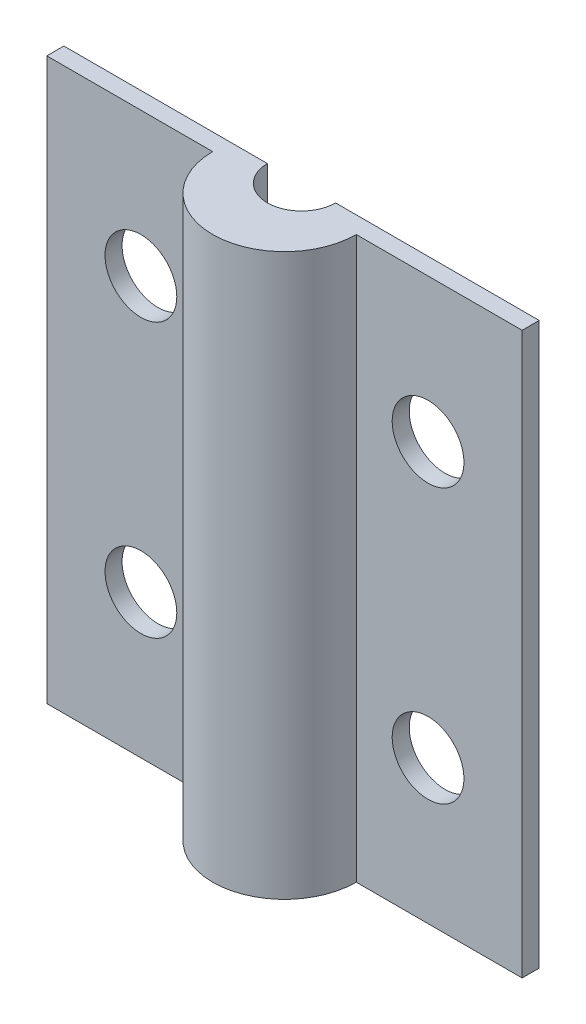
ISO-10303-21;
HEADER;
FILE_DESCRIPTION(('STEP AP214'),'2;1');
FILE_NAME('part.step','',(''),(''),'','','');
FILE_SCHEMA(('AUTOMOTIVE_DESIGN { 1 0 10303 214 1 1 1 1 }'));
ENDSEC;
DATA;
#1=APPLICATION_CONTEXT('core data for automotive mechanical design processes');
#2=APPLICATION_PROTOCOL_DEFINITION('international standard','automotive_design',2000,#1);
#3=PRODUCT_CONTEXT('',#1,'mechanical');
#4=PRODUCT('Part','Part','',(#3));
#5=PRODUCT_RELATED_PRODUCT_CATEGORY('part','',(#4));
#6=PRODUCT_DEFINITION_FORMATION('','',#4);
#7=PRODUCT_DEFINITION_CONTEXT('part definition',#1,'design');
#8=PRODUCT_DEFINITION('design','',#6,#7);
#9=PRODUCT_DEFINITION_SHAPE('','',#8);
#10=(LENGTH_UNIT() NAMED_UNIT(*) SI_UNIT(.MILLI.,.METRE.));
#11=(NAMED_UNIT(*) PLANE_ANGLE_UNIT() SI_UNIT($,.RADIAN.));
#12=(NAMED_UNIT(*) SI_UNIT($,.STERADIAN.) SOLID_ANGLE_UNIT());
#13=UNCERTAINTY_MEASURE_WITH_UNIT(LENGTH_MEASURE(1.E-05),#10,'distance_accuracy_value','');
#14=(GEOMETRIC_REPRESENTATION_CONTEXT(3) GLOBAL_UNCERTAINTY_ASSIGNED_CONTEXT((#13)) GLOBAL_UNIT_ASSIGNED_CONTEXT((#10,
#11,#12)) REPRESENTATION_CONTEXT('',''));
#15=CARTESIAN_POINT('',(0.,0.,0.));
#16=DIRECTION('',(0.,0.,1.));
#17=DIRECTION('',(1.,0.,0.));
#18=AXIS2_PLACEMENT_3D('',#15,#16,#17);
#19=CARTESIAN_POINT('',(-41.3467242837808,6.02303077491915,3.302));
#20=DIRECTION('',(0.,1.,0.));
#21=DIRECTION('',(0.,0.,1.));
#22=AXIS2_PLACEMENT_3D('',#19,#20,#21);
#23=PLANE('',#22);
#24=DIRECTION('',(0.,0.,1.));
#25=VECTOR('',#24,1.);
#26=CARTESIAN_POINT('',(-17.3248757143741,6.02303077491915,3.302));
#27=LINE('',#26,#25);
#28=CARTESIAN_POINT('',(-17.3248757143741,6.02303077491915,0.));
#29=VERTEX_POINT('',#28);
#30=CARTESIAN_POINT('',(-17.3248757143741,6.02303077491915,0.60325));
#31=VERTEX_POINT('',#30);
#32=EDGE_CURVE('E104',#29,#31,#27,.T.);
#33=ORIENTED_EDGE('',*,*,#32,.T.);
#34=DIRECTION('',(-1.,0.,0.));
#35=VECTOR('',#34,1.);
#36=CARTESIAN_POINT('',(-16.9621817797875,6.02303077491915,0.60325));
#37=LINE('',#36,#35);
#38=CARTESIAN_POINT('',(-23.1943252375096,6.02303077491915,0.60325));
#39=VERTEX_POINT('',#38);
#40=EDGE_CURVE('E184',#31,#39,#37,.T.);
#41=ORIENTED_EDGE('',*,*,#40,.T.);
#42=CARTESIAN_POINT('',(-25.7343252375096,6.02303077491915,0.60325));
#43=DIRECTION('',(0.,1.,0.));
#44=DIRECTION('',(0.,0.,1.));
#45=AXIS2_PLACEMENT_3D('',#42,#43,#44);
#46=CIRCLE('',#45,2.54);
#47=CARTESIAN_POINT('',(-28.2743252375096,6.02303077491915,0.60325));
#48=VERTEX_POINT('',#47);
#49=EDGE_CURVE('E150',#48,#39,#46,.T.);
#50=ORIENTED_EDGE('',*,*,#49,.F.);
#51=DIRECTION('',(1.,0.,0.));
#52=VECTOR('',#51,1.);
#53=CARTESIAN_POINT('',(-34.5064686952317,6.02303077491915,0.60325));
#54=LINE('',#53,#52);
#55=CARTESIAN_POINT('',(-34.1437747606452,6.02303077491915,0.60325));
#56=VERTEX_POINT('',#55);
#57=EDGE_CURVE('E142',#56,#48,#54,.T.);
#58=ORIENTED_EDGE('',*,*,#57,.F.);
#59=DIRECTION('',(0.,0.,1.));
#60=VECTOR('',#59,1.);
#61=CARTESIAN_POINT('',(-34.1437747606452,6.02303077491915,3.302));
#62=LINE('',#61,#60);
#63=CARTESIAN_POINT('',(-34.1437747606452,6.02303077491915,0.));
#64=VERTEX_POINT('',#63);
#65=EDGE_CURVE('E64',#64,#56,#62,.T.);
#66=ORIENTED_EDGE('',*,*,#65,.F.);
#67=DIRECTION('',(1.,0.,0.));
#68=VECTOR('',#67,1.);
#69=CARTESIAN_POINT('',(-41.3467242837808,6.02303077491915,0.));
#70=LINE('',#69,#68);
#71=CARTESIAN_POINT('',(-26.9408252375096,6.02303077491915,0.));
#72=VERTEX_POINT('',#71);
#73=EDGE_CURVE('E124',#64,#72,#70,.T.);
#74=ORIENTED_EDGE('',*,*,#73,.T.);
#75=CARTESIAN_POINT('',(-25.7343252375096,6.02303077491915,0.));
#76=DIRECTION('',(0.,-1.,0.));
#77=DIRECTION('',(0.,0.,-1.));
#78=AXIS2_PLACEMENT_3D('',#75,#76,#77);
#79=CIRCLE('',#78,1.2065);
#80=CARTESIAN_POINT('',(-24.5278252375096,6.02303077491915,0.));
#81=VERTEX_POINT('',#80);
#82=EDGE_CURVE('E123',#81,#72,#79,.T.);
#83=ORIENTED_EDGE('',*,*,#82,.F.);
#84=EDGE_CURVE('E118',#81,#29,#70,.T.);
#85=ORIENTED_EDGE('',*,*,#84,.T.);
#86=EDGE_LOOP('',(#33,#41,#50,#58,#66,#74,#83,#85));
#87=FACE_BOUND('',#86,.T.);
#88=ADVANCED_FACE('F43',(#87),#23,.F.);
#89=CARTESIAN_POINT('',(-41.3467242837808,25.870372072608,3.302));
#90=DIRECTION('',(0.,-1.,0.));
#91=DIRECTION('',(0.,0.,-1.));
#92=AXIS2_PLACEMENT_3D('',#89,#90,#91);
#93=PLANE('',#92);
#94=DIRECTION('',(0.,0.,-1.));
#95=VECTOR('',#94,1.);
#96=CARTESIAN_POINT('',(-17.3248757143741,25.870372072608,3.302));
#97=LINE('',#96,#95);
#98=CARTESIAN_POINT('',(-17.3248757143741,25.870372072608,0.60325));
#99=VERTEX_POINT('',#98);
#100=CARTESIAN_POINT('',(-17.3248757143741,25.870372072608,0.));
#101=VERTEX_POINT('',#100);
#102=EDGE_CURVE('E57',#99,#101,#97,.T.);
#103=ORIENTED_EDGE('',*,*,#102,.T.);
#104=DIRECTION('',(-1.,0.,0.));
#105=VECTOR('',#104,1.);
#106=CARTESIAN_POINT('',(-41.3467242837808,25.870372072608,0.));
#107=LINE('',#106,#105);
#108=CARTESIAN_POINT('',(-24.5278252375096,25.870372072608,0.));
#109=VERTEX_POINT('',#108);
#110=EDGE_CURVE('E119',#101,#109,#107,.T.);
#111=ORIENTED_EDGE('',*,*,#110,.T.);
#112=CARTESIAN_POINT('',(-25.7343252375096,25.870372072608,0.));
#113=DIRECTION('',(0.,-1.,0.));
#114=DIRECTION('',(0.,0.,-1.));
#115=AXIS2_PLACEMENT_3D('',#112,#113,#114);
#116=CIRCLE('',#115,1.2065);
#117=CARTESIAN_POINT('',(-26.9408252375096,25.870372072608,0.));
#118=VERTEX_POINT('',#117);
#119=EDGE_CURVE('E125',#118,#109,#116,.F.);
#120=ORIENTED_EDGE('',*,*,#119,.F.);
#121=CARTESIAN_POINT('',(-34.1437747606452,25.870372072608,0.));
#122=VERTEX_POINT('',#121);
#123=EDGE_CURVE('E127',#118,#122,#107,.T.);
#124=ORIENTED_EDGE('',*,*,#123,.T.);
#125=DIRECTION('',(0.,0.,-1.));
#126=VECTOR('',#125,1.);
#127=CARTESIAN_POINT('',(-34.1437747606452,25.870372072608,3.302));
#128=LINE('',#127,#126);
#129=CARTESIAN_POINT('',(-34.1437747606452,25.870372072608,0.60325));
#130=VERTEX_POINT('',#129);
#131=EDGE_CURVE('E172',#130,#122,#128,.T.);
#132=ORIENTED_EDGE('',*,*,#131,.F.);
#133=DIRECTION('',(-1.,0.,0.));
#134=VECTOR('',#133,1.);
#135=CARTESIAN_POINT('',(-34.5064686952317,25.870372072608,0.60325));
#136=LINE('',#135,#134);
#137=CARTESIAN_POINT('',(-28.2743252375096,25.870372072608,0.60325));
#138=VERTEX_POINT('',#137);
#139=EDGE_CURVE('E145',#138,#130,#136,.T.);
#140=ORIENTED_EDGE('',*,*,#139,.F.);
#141=CARTESIAN_POINT('',(-25.7343252375096,25.870372072608,0.60325));
#142=DIRECTION('',(0.,-1.,0.));
#143=DIRECTION('',(0.,0.,-1.));
#144=AXIS2_PLACEMENT_3D('',#141,#142,#143);
#145=CIRCLE('',#144,2.54);
#146=CARTESIAN_POINT('',(-23.1943252375096,25.870372072608,0.60325));
#147=VERTEX_POINT('',#146);
#148=EDGE_CURVE('E182',#147,#138,#145,.T.);
#149=ORIENTED_EDGE('',*,*,#148,.F.);
#150=DIRECTION('',(1.,0.,0.));
#151=VECTOR('',#150,1.);
#152=CARTESIAN_POINT('',(-16.9621817797875,25.870372072608,0.60325));
#153=LINE('',#152,#151);
#154=EDGE_CURVE('E152',#147,#99,#153,.T.);
#155=ORIENTED_EDGE('',*,*,#154,.T.);
#156=EDGE_LOOP('',(#103,#111,#120,#124,#132,#140,#149,#155));
#157=FACE_BOUND('',#156,.T.);
#158=ADVANCED_FACE('F171',(#157),#93,.F.);
#159=CARTESIAN_POINT('',(0.,0.,0.));
#160=DIRECTION('',(0.,0.,1.));
#161=DIRECTION('',(1.,0.,0.));
#162=AXIS2_PLACEMENT_3D('',#159,#160,#161);
#163=PLANE('',#162);
#164=CARTESIAN_POINT('',(-20.6543252375096,11.1030307749191,0.));
#165=DIRECTION('',(0.,0.,1.));
#166=DIRECTION('',(1.,0.,0.));
#167=AXIS2_PLACEMENT_3D('',#164,#165,#166);
#168=CIRCLE('',#167,1.27);
#169=CARTESIAN_POINT('',(-19.3843252375096,11.1030307749191,0.));
#170=VERTEX_POINT('',#169);
#171=EDGE_CURVE('E229',#170,#170,#168,.T.);
#172=ORIENTED_EDGE('',*,*,#171,.T.);
#173=EDGE_LOOP('',(#172));
#174=FACE_BOUND('',#173,.T.);
#175=CARTESIAN_POINT('',(-20.6543252375096,20.790372072608,0.));
#176=DIRECTION('',(0.,0.,1.));
#177=DIRECTION('',(1.,0.,0.));
#178=AXIS2_PLACEMENT_3D('',#175,#176,#177);
#179=CIRCLE('',#178,1.27);
#180=CARTESIAN_POINT('',(-19.3843252375096,20.790372072608,0.));
#181=VERTEX_POINT('',#180);
#182=EDGE_CURVE('E228',#181,#181,#179,.F.);
#183=ORIENTED_EDGE('',*,*,#182,.F.);
#184=EDGE_LOOP('',(#183));
#185=FACE_BOUND('',#184,.T.);
#186=DIRECTION('',(0.,-1.,0.));
#187=VECTOR('',#186,1.);
#188=CARTESIAN_POINT('',(-17.3248757143741,33.7941139811281,0.));
#189=LINE('',#188,#187);
#190=EDGE_CURVE('E107',#101,#29,#189,.T.);
#191=ORIENTED_EDGE('',*,*,#190,.T.);
#192=ORIENTED_EDGE('',*,*,#84,.F.);
#193=DIRECTION('',(0.,-1.,0.));
#194=VECTOR('',#193,1.);
#195=CARTESIAN_POINT('',(-24.5278252375096,29.2828693986142,0.));
#196=LINE('',#195,#194);
#197=EDGE_CURVE('E133',#81,#109,#196,.F.);
#198=ORIENTED_EDGE('',*,*,#197,.T.);
#199=ORIENTED_EDGE('',*,*,#110,.F.);
#200=EDGE_LOOP('',(#191,#192,#198,#199));
#201=FACE_BOUND('',#200,.T.);
#202=ADVANCED_FACE('F116',(#174,#185,#201),#163,.F.);
#203=CARTESIAN_POINT('',(-16.9621817797875,32.6617536434026,0.60325));
#204=DIRECTION('',(0.,0.,1.));
#205=DIRECTION('',(1.,0.,0.));
#206=AXIS2_PLACEMENT_3D('',#203,#204,#205);
#207=PLANE('',#206);
#208=CARTESIAN_POINT('',(-20.6543252375096,11.1030307749191,0.60325));
#209=DIRECTION('',(0.,0.,-1.));
#210=DIRECTION('',(-1.,0.,0.));
#211=AXIS2_PLACEMENT_3D('',#208,#209,#210);
#212=CIRCLE('',#211,1.27);
#213=CARTESIAN_POINT('',(-21.9243252375096,11.1030307749191,0.60325));
#214=VERTEX_POINT('',#213);
#215=EDGE_CURVE('E223',#214,#214,#212,.T.);
#216=ORIENTED_EDGE('',*,*,#215,.T.);
#217=EDGE_LOOP('',(#216));
#218=FACE_BOUND('',#217,.T.);
#219=CARTESIAN_POINT('',(-20.6543252375096,20.790372072608,0.60325));
#220=DIRECTION('',(0.,0.,1.));
#221=DIRECTION('',(-1.,0.,0.));
#222=AXIS2_PLACEMENT_3D('',#219,#220,#221);
#223=CIRCLE('',#222,1.27);
#224=CARTESIAN_POINT('',(-21.9243252375096,20.790372072608,0.60325));
#225=VERTEX_POINT('',#224);
#226=EDGE_CURVE('E226',#225,#225,#223,.T.);
#227=ORIENTED_EDGE('',*,*,#226,.F.);
#228=EDGE_LOOP('',(#227));
#229=FACE_BOUND('',#228,.T.);
#230=ORIENTED_EDGE('',*,*,#40,.F.);
#231=DIRECTION('',(0.,1.,0.));
#232=VECTOR('',#231,1.);
#233=CARTESIAN_POINT('',(-17.3248757143741,32.6617536434026,0.60325));
#234=LINE('',#233,#232);
#235=EDGE_CURVE('E11',#31,#99,#234,.T.);
#236=ORIENTED_EDGE('',*,*,#235,.T.);
#237=ORIENTED_EDGE('',*,*,#154,.F.);
#238=DIRECTION('',(0.,-1.,0.));
#239=VECTOR('',#238,1.);
#240=CARTESIAN_POINT('',(-23.1943252375096,32.6617536434026,0.60325));
#241=LINE('',#240,#239);
#242=EDGE_CURVE('E156',#147,#39,#241,.T.);
#243=ORIENTED_EDGE('',*,*,#242,.T.);
#244=EDGE_LOOP('',(#230,#236,#237,#243));
#245=FACE_BOUND('',#244,.T.);
#246=ADVANCED_FACE('F187',(#218,#229,#245),#207,.T.);
#247=CARTESIAN_POINT('',(-30.8143252375096,20.790372072608,0.));
#248=DIRECTION('',(0.,0.,1.));
#249=DIRECTION('',(1.,0.,0.));
#250=AXIS2_PLACEMENT_3D('',#247,#248,#249);
#251=CIRCLE('',#250,1.27);
#252=CARTESIAN_POINT('',(-29.5443252375096,20.790372072608,0.));
#253=VERTEX_POINT('',#252);
#254=EDGE_CURVE('E240',#253,#253,#251,.T.);
#255=ORIENTED_EDGE('',*,*,#254,.T.);
#256=EDGE_LOOP('',(#255));
#257=FACE_BOUND('',#256,.T.);
#258=CARTESIAN_POINT('',(-30.8143252375096,11.1030307749191,0.));
#259=DIRECTION('',(0.,0.,1.));
#260=DIRECTION('',(1.,0.,0.));
#261=AXIS2_PLACEMENT_3D('',#258,#259,#260);
#262=CIRCLE('',#261,1.27);
#263=CARTESIAN_POINT('',(-29.5443252375096,11.1030307749191,0.));
#264=VERTEX_POINT('',#263);
#265=EDGE_CURVE('E111',#264,#264,#262,.F.);
#266=ORIENTED_EDGE('',*,*,#265,.F.);
#267=EDGE_LOOP('',(#266));
#268=FACE_BOUND('',#267,.T.);
#269=ORIENTED_EDGE('',*,*,#73,.F.);
#270=DIRECTION('',(0.,-1.,0.));
#271=VECTOR('',#270,1.);
#272=CARTESIAN_POINT('',(-34.1437747606452,33.7941139811281,0.));
#273=LINE('',#272,#271);
#274=EDGE_CURVE('E169',#122,#64,#273,.T.);
#275=ORIENTED_EDGE('',*,*,#274,.F.);
#276=ORIENTED_EDGE('',*,*,#123,.F.);
#277=DIRECTION('',(0.,-1.,0.));
#278=VECTOR('',#277,1.);
#279=CARTESIAN_POINT('',(-26.9408252375096,29.2828693986142,0.));
#280=LINE('',#279,#278);
#281=EDGE_CURVE('E135',#118,#72,#280,.T.);
#282=ORIENTED_EDGE('',*,*,#281,.T.);
#283=EDGE_LOOP('',(#269,#275,#276,#282));
#284=FACE_BOUND('',#283,.T.);
#285=ADVANCED_FACE('F166',(#257,#268,#284),#163,.F.);
#286=CARTESIAN_POINT('',(-25.7343252375096,29.2828693986142,0.));
#287=DIRECTION('',(0.,-1.,0.));
#288=DIRECTION('',(0.,0.,-1.));
#289=AXIS2_PLACEMENT_3D('',#286,#287,#288);
#290=CYLINDRICAL_SURFACE('',#289,1.2065);
#291=ORIENTED_EDGE('',*,*,#119,.T.);
#292=ORIENTED_EDGE('',*,*,#197,.F.);
#293=ORIENTED_EDGE('',*,*,#82,.T.);
#294=ORIENTED_EDGE('',*,*,#281,.F.);
#295=EDGE_LOOP('',(#291,#292,#293,#294));
#296=FACE_BOUND('',#295,.T.);
#297=ADVANCED_FACE('F162',(#296),#290,.F.);
#298=CARTESIAN_POINT('',(-34.5064686952317,32.6617536434026,0.60325));
#299=DIRECTION('',(0.,0.,-1.));
#300=DIRECTION('',(-1.,0.,0.));
#301=AXIS2_PLACEMENT_3D('',#298,#299,#300);
#302=PLANE('',#301);
#303=CARTESIAN_POINT('',(-30.8143252375096,20.790372072608,0.60325));
#304=DIRECTION('',(0.,0.,-1.));
#305=DIRECTION('',(1.,0.,0.));
#306=AXIS2_PLACEMENT_3D('',#303,#304,#305);
#307=CIRCLE('',#306,1.27);
#308=CARTESIAN_POINT('',(-29.5443252375096,20.790372072608,0.60325));
#309=VERTEX_POINT('',#308);
#310=EDGE_CURVE('E232',#309,#309,#307,.T.);
#311=ORIENTED_EDGE('',*,*,#310,.T.);
#312=EDGE_LOOP('',(#311));
#313=FACE_BOUND('',#312,.T.);
#314=CARTESIAN_POINT('',(-30.8143252375096,11.1030307749191,0.60325));
#315=DIRECTION('',(0.,0.,1.));
#316=DIRECTION('',(1.,0.,0.));
#317=AXIS2_PLACEMENT_3D('',#314,#315,#316);
#318=CIRCLE('',#317,1.27);
#319=CARTESIAN_POINT('',(-29.5443252375096,11.1030307749191,0.60325));
#320=VERTEX_POINT('',#319);
#321=EDGE_CURVE('E242',#320,#320,#318,.T.);
#322=ORIENTED_EDGE('',*,*,#321,.F.);
#323=EDGE_LOOP('',(#322));
#324=FACE_BOUND('',#323,.T.);
#325=ORIENTED_EDGE('',*,*,#139,.T.);
#326=DIRECTION('',(0.,-1.,0.));
#327=VECTOR('',#326,1.);
#328=CARTESIAN_POINT('',(-34.1437747606452,32.6617536434026,0.60325));
#329=LINE('',#328,#327);
#330=EDGE_CURVE('E50',#130,#56,#329,.T.);
#331=ORIENTED_EDGE('',*,*,#330,.T.);
#332=ORIENTED_EDGE('',*,*,#57,.T.);
#333=DIRECTION('',(0.,-1.,0.));
#334=VECTOR('',#333,1.);
#335=CARTESIAN_POINT('',(-28.2743252375096,32.6617536434026,0.60325));
#336=LINE('',#335,#334);
#337=EDGE_CURVE('E151',#138,#48,#336,.T.);
#338=ORIENTED_EDGE('',*,*,#337,.F.);
#339=EDGE_LOOP('',(#325,#331,#332,#338));
#340=FACE_BOUND('',#339,.T.);
#341=ADVANCED_FACE('F140',(#313,#324,#340),#302,.F.);
#342=CARTESIAN_POINT('',(-25.7343252375096,31.6227325935159,0.60325));
#343=DIRECTION('',(0.,-1.,0.));
#344=DIRECTION('',(0.,0.,-1.));
#345=AXIS2_PLACEMENT_3D('',#342,#343,#344);
#346=CYLINDRICAL_SURFACE('',#345,2.54);
#347=ORIENTED_EDGE('',*,*,#148,.T.);
#348=ORIENTED_EDGE('',*,*,#337,.T.);
#349=ORIENTED_EDGE('',*,*,#49,.T.);
#350=ORIENTED_EDGE('',*,*,#242,.F.);
#351=EDGE_LOOP('',(#347,#348,#349,#350));
#352=FACE_BOUND('',#351,.T.);
#353=ADVANCED_FACE('F189',(#352),#346,.T.);
#354=CARTESIAN_POINT('',(-34.1437747606452,33.7941139811281,3.302));
#355=DIRECTION('',(1.,0.,0.));
#356=DIRECTION('',(0.,0.,-1.));
#357=AXIS2_PLACEMENT_3D('',#354,#355,#356);
#358=PLANE('',#357);
#359=ORIENTED_EDGE('',*,*,#131,.T.);
#360=ORIENTED_EDGE('',*,*,#274,.T.);
#361=ORIENTED_EDGE('',*,*,#65,.T.);
#362=ORIENTED_EDGE('',*,*,#330,.F.);
#363=EDGE_LOOP('',(#359,#360,#361,#362));
#364=FACE_BOUND('',#363,.T.);
#365=ADVANCED_FACE('F191',(#364),#358,.F.);
#366=CARTESIAN_POINT('',(-17.3248757143741,33.7941139811281,3.302));
#367=DIRECTION('',(1.,0.,0.));
#368=DIRECTION('',(0.,0.,-1.));
#369=AXIS2_PLACEMENT_3D('',#366,#367,#368);
#370=PLANE('',#369);
#371=ORIENTED_EDGE('',*,*,#32,.F.);
#372=ORIENTED_EDGE('',*,*,#190,.F.);
#373=ORIENTED_EDGE('',*,*,#102,.F.);
#374=ORIENTED_EDGE('',*,*,#235,.F.);
#375=EDGE_LOOP('',(#371,#372,#373,#374));
#376=FACE_BOUND('',#375,.T.);
#377=ADVANCED_FACE('F106',(#376),#370,.T.);
#378=CARTESIAN_POINT('',(-30.8143252375096,11.1030307749191,-3.59210244842765));
#379=DIRECTION('',(0.,0.,1.));
#380=DIRECTION('',(1.,0.,0.));
#381=AXIS2_PLACEMENT_3D('',#378,#379,#380);
#382=CYLINDRICAL_SURFACE('',#381,1.27);
#383=ORIENTED_EDGE('',*,*,#265,.T.);
#384=EDGE_LOOP('',(#383));
#385=FACE_BOUND('',#384,.T.);
#386=ORIENTED_EDGE('',*,*,#321,.T.);
#387=EDGE_LOOP('',(#386));
#388=FACE_BOUND('',#387,.T.);
#389=ADVANCED_FACE('F249',(#385,#388),#382,.F.);
#390=CARTESIAN_POINT('',(-30.8143252375096,20.790372072608,-3.59210244842765));
#391=DIRECTION('',(0.,0.,1.));
#392=DIRECTION('',(1.,0.,0.));
#393=AXIS2_PLACEMENT_3D('',#390,#391,#392);
#394=CYLINDRICAL_SURFACE('',#393,1.27);
#395=ORIENTED_EDGE('',*,*,#254,.F.);
#396=EDGE_LOOP('',(#395));
#397=FACE_BOUND('',#396,.T.);
#398=ORIENTED_EDGE('',*,*,#310,.F.);
#399=EDGE_LOOP('',(#398));
#400=FACE_BOUND('',#399,.T.);
#401=ADVANCED_FACE('F252',(#397,#400),#394,.F.);
#402=CARTESIAN_POINT('',(-20.6543252375096,20.790372072608,-3.59210244842765));
#403=DIRECTION('',(0.,0.,1.));
#404=DIRECTION('',(1.,0.,0.));
#405=AXIS2_PLACEMENT_3D('',#402,#403,#404);
#406=CYLINDRICAL_SURFACE('',#405,1.27);
#407=ORIENTED_EDGE('',*,*,#182,.T.);
#408=EDGE_LOOP('',(#407));
#409=FACE_BOUND('',#408,.T.);
#410=ORIENTED_EDGE('',*,*,#226,.T.);
#411=EDGE_LOOP('',(#410));
#412=FACE_BOUND('',#411,.T.);
#413=ADVANCED_FACE('F257',(#409,#412),#406,.F.);
#414=CARTESIAN_POINT('',(-20.6543252375096,11.1030307749191,-3.59210244842765));
#415=DIRECTION('',(0.,0.,1.));
#416=DIRECTION('',(1.,0.,0.));
#417=AXIS2_PLACEMENT_3D('',#414,#415,#416);
#418=CYLINDRICAL_SURFACE('',#417,1.27);
#419=ORIENTED_EDGE('',*,*,#171,.F.);
#420=EDGE_LOOP('',(#419));
#421=FACE_BOUND('',#420,.T.);
#422=ORIENTED_EDGE('',*,*,#215,.F.);
#423=EDGE_LOOP('',(#422));
#424=FACE_BOUND('',#423,.T.);
#425=ADVANCED_FACE('F263',(#421,#424),#418,.F.);
#426=CLOSED_SHELL('',(#88,#158,#202,#246,#285,#297,#341,#353,#365,#377,#389,#401,#413,#425));
#427=MANIFOLD_SOLID_BREP('B2',#426);
#428=ADVANCED_BREP_SHAPE_REPRESENTATION('',(#18,#427),#14);
#429=SHAPE_DEFINITION_REPRESENTATION(#9,#428);
ENDSEC;
END-ISO-10303-21;
